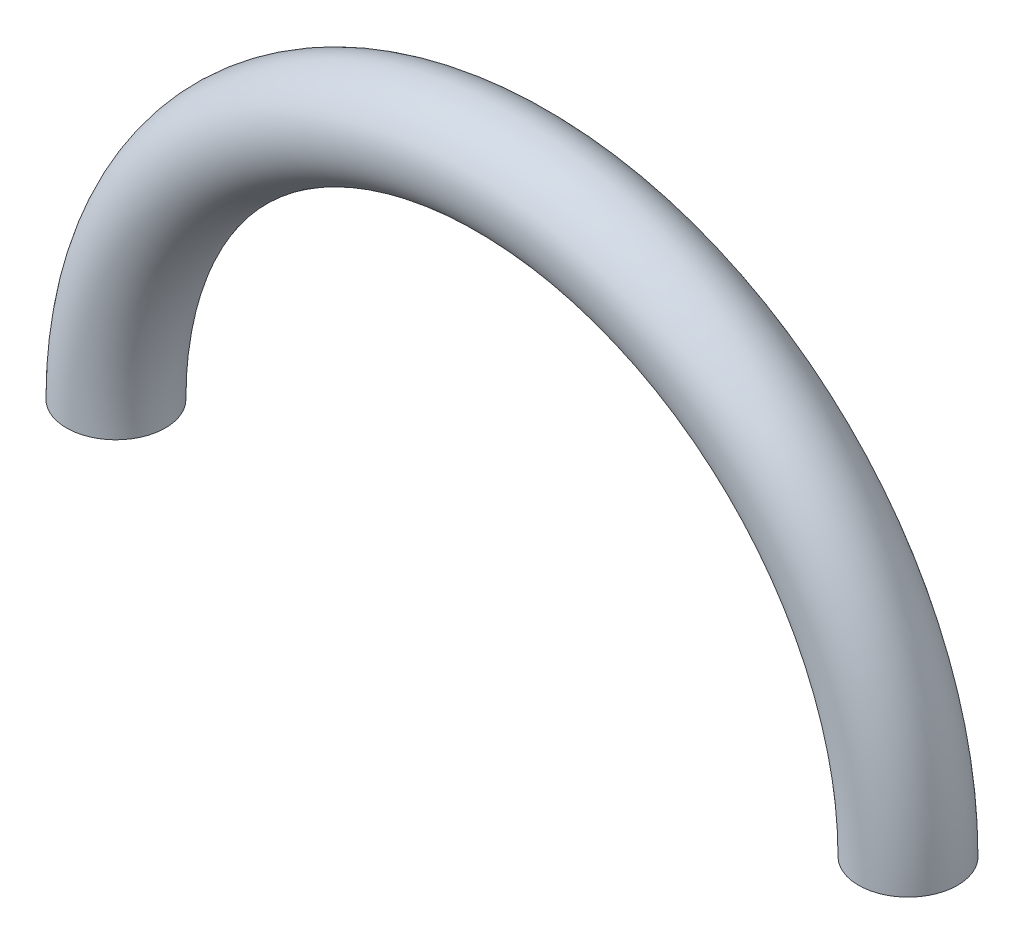
ISO-10303-21;
HEADER;
FILE_DESCRIPTION(('STEP AP214'),'2;1');
FILE_NAME('part.step','',(''),(''),'','','');
FILE_SCHEMA(('AUTOMOTIVE_DESIGN { 1 0 10303 214 1 1 1 1 }'));
ENDSEC;
DATA;
#1=APPLICATION_CONTEXT('core data for automotive mechanical design processes');
#2=APPLICATION_PROTOCOL_DEFINITION('international standard','automotive_design',2000,#1);
#3=PRODUCT_CONTEXT('',#1,'mechanical');
#4=PRODUCT('Part','Part','',(#3));
#5=PRODUCT_RELATED_PRODUCT_CATEGORY('part','',(#4));
#6=PRODUCT_DEFINITION_FORMATION('','',#4);
#7=PRODUCT_DEFINITION_CONTEXT('part definition',#1,'design');
#8=PRODUCT_DEFINITION('design','',#6,#7);
#9=PRODUCT_DEFINITION_SHAPE('','',#8);
#10=(LENGTH_UNIT() NAMED_UNIT(*) SI_UNIT(.MILLI.,.METRE.));
#11=(NAMED_UNIT(*) PLANE_ANGLE_UNIT() SI_UNIT($,.RADIAN.));
#12=(NAMED_UNIT(*) SI_UNIT($,.STERADIAN.) SOLID_ANGLE_UNIT());
#13=UNCERTAINTY_MEASURE_WITH_UNIT(LENGTH_MEASURE(1.E-05),#10,'distance_accuracy_value','');
#14=(GEOMETRIC_REPRESENTATION_CONTEXT(3) GLOBAL_UNCERTAINTY_ASSIGNED_CONTEXT((#13)) GLOBAL_UNIT_ASSIGNED_CONTEXT((#10,
#11,#12)) REPRESENTATION_CONTEXT('',''));
#15=CARTESIAN_POINT('',(0.,0.,0.));
#16=DIRECTION('',(0.,0.,1.));
#17=DIRECTION('',(1.,0.,0.));
#18=AXIS2_PLACEMENT_3D('',#15,#16,#17);
#19=CARTESIAN_POINT('',(0.,0.,0.));
#20=DIRECTION('',(0.,0.,-1.));
#21=DIRECTION('',(-1.,0.,0.));
#22=AXIS2_PLACEMENT_3D('',#19,#20,#21);
#23=TOROIDAL_SURFACE('',#22,127.,12.69);
#24=CARTESIAN_POINT('',(-127.,-8.86836260066156E-13,0.));
#25=DIRECTION('',(0.,1.,0.));
#26=DIRECTION('',(0.,0.,-1.));
#27=AXIS2_PLACEMENT_3D('',#24,#25,#26);
#28=CIRCLE('',#27,12.69);
#29=CARTESIAN_POINT('',(-139.69,-9.75450056445995E-13,0.));
#30=VERTEX_POINT('',#29);
#31=EDGE_CURVE('E11',#30,#30,#28,.T.);
#32=CARTESIAN_POINT('',(127.,0.,0.));
#33=DIRECTION('',(0.,-1.,0.));
#34=DIRECTION('',(0.,0.,-1.));
#35=AXIS2_PLACEMENT_3D('',#32,#33,#34);
#36=CIRCLE('',#35,12.69);
#37=CARTESIAN_POINT('',(139.69,0.,0.));
#38=VERTEX_POINT('',#37);
#39=EDGE_CURVE('E62',#38,#38,#36,.T.);
#40=CARTESIAN_POINT('',(0.,0.,0.));
#41=DIRECTION('',(0.,0.,-1.));
#42=DIRECTION('',(-1.,0.,0.));
#43=AXIS2_PLACEMENT_3D('',#40,#41,#42);
#44=CIRCLE('',#43,139.69);
#45=EDGE_CURVE('',#30,#38,#44,.T.);
#46=ORIENTED_EDGE('',*,*,#31,.T.);
#47=ORIENTED_EDGE('',*,*,#39,.F.);
#48=ORIENTED_EDGE('',*,*,#45,.T.);
#49=ORIENTED_EDGE('',*,*,#45,.F.);
#50=EDGE_LOOP('',(#46,#48,#47,#49));
#51=FACE_BOUND('',#50,.T.);
#52=ADVANCED_FACE('F55',(#51),#23,.T.);
#53=CARTESIAN_POINT('',(-127.,-8.86836260066156E-13,0.));
#54=DIRECTION('',(0.,1.,0.));
#55=DIRECTION('',(0.,0.,-1.));
#56=AXIS2_PLACEMENT_3D('',#53,#54,#55);
#57=PLANE('',#56);
#58=ORIENTED_EDGE('',*,*,#31,.F.);
#59=EDGE_LOOP('',(#58));
#60=FACE_BOUND('',#59,.T.);
#61=ADVANCED_FACE('F72',(#60),#57,.F.);
#62=CARTESIAN_POINT('',(127.,0.,0.));
#63=DIRECTION('',(0.,-1.,0.));
#64=DIRECTION('',(0.,0.,-1.));
#65=AXIS2_PLACEMENT_3D('',#62,#63,#64);
#66=PLANE('',#65);
#67=ORIENTED_EDGE('',*,*,#39,.T.);
#68=EDGE_LOOP('',(#67));
#69=FACE_BOUND('',#68,.T.);
#70=ADVANCED_FACE('F69',(#69),#66,.T.);
#71=CLOSED_SHELL('',(#52,#61,#70));
#72=MANIFOLD_SOLID_BREP('B2',#71);
#73=CARTESIAN_POINT('',(0.,0.,0.));
#74=DIRECTION('',(0.,0.,-1.));
#75=DIRECTION('',(-1.,0.,0.));
#76=AXIS2_PLACEMENT_3D('',#73,#74,#75);
#77=TOROIDAL_SURFACE('',#76,127.,12.7);
#78=CARTESIAN_POINT('',(-127.,-8.86836260066156E-13,0.));
#79=DIRECTION('',(0.,-1.,0.));
#80=DIRECTION('',(0.,0.,1.));
#81=AXIS2_PLACEMENT_3D('',#78,#79,#80);
#82=CIRCLE('',#81,12.7);
#83=CARTESIAN_POINT('',(-139.7,-9.75519886072771E-13,0.));
#84=VERTEX_POINT('',#83);
#85=EDGE_CURVE('E105',#84,#84,#82,.T.);
#86=CARTESIAN_POINT('',(127.,0.,0.));
#87=DIRECTION('',(0.,1.,0.));
#88=DIRECTION('',(0.,0.,1.));
#89=AXIS2_PLACEMENT_3D('',#86,#87,#88);
#90=CIRCLE('',#89,12.7);
#91=CARTESIAN_POINT('',(139.7,0.,0.));
#92=VERTEX_POINT('',#91);
#93=EDGE_CURVE('E113',#92,#92,#90,.T.);
#94=CARTESIAN_POINT('',(0.,0.,0.));
#95=DIRECTION('',(0.,0.,-1.));
#96=DIRECTION('',(-1.,0.,0.));
#97=AXIS2_PLACEMENT_3D('',#94,#95,#96);
#98=CIRCLE('',#97,139.7);
#99=EDGE_CURVE('',#84,#92,#98,.T.);
#100=ORIENTED_EDGE('',*,*,#85,.T.);
#101=ORIENTED_EDGE('',*,*,#93,.F.);
#102=ORIENTED_EDGE('',*,*,#99,.T.);
#103=ORIENTED_EDGE('',*,*,#99,.F.);
#104=EDGE_LOOP('',(#100,#102,#101,#103));
#105=FACE_BOUND('',#104,.T.);
#106=ADVANCED_FACE('F98',(#105),#77,.F.);
#107=CARTESIAN_POINT('',(0.,0.,0.));
#108=DIRECTION('',(0.,0.,-1.));
#109=DIRECTION('',(-1.,0.,0.));
#110=AXIS2_PLACEMENT_3D('',#107,#108,#109);
#111=TOROIDAL_SURFACE('',#110,127.,15.875);
#112=CARTESIAN_POINT('',(-127.,-8.86836260066156E-13,0.));
#113=DIRECTION('',(0.,-1.,0.));
#114=DIRECTION('',(0.,0.,1.));
#115=AXIS2_PLACEMENT_3D('',#112,#113,#114);
#116=CIRCLE('',#115,15.875);
#117=CARTESIAN_POINT('',(-142.875,-9.97690792574425E-13,0.));
#118=VERTEX_POINT('',#117);
#119=EDGE_CURVE('E54',#118,#118,#116,.T.);
#120=CARTESIAN_POINT('',(127.,0.,0.));
#121=DIRECTION('',(0.,1.,0.));
#122=DIRECTION('',(0.,0.,1.));
#123=AXIS2_PLACEMENT_3D('',#120,#121,#122);
#124=CIRCLE('',#123,15.875);
#125=CARTESIAN_POINT('',(142.875,0.,0.));
#126=VERTEX_POINT('',#125);
#127=EDGE_CURVE('E109',#126,#126,#124,.T.);
#128=CARTESIAN_POINT('',(0.,0.,0.));
#129=DIRECTION('',(0.,0.,-1.));
#130=DIRECTION('',(-1.,0.,0.));
#131=AXIS2_PLACEMENT_3D('',#128,#129,#130);
#132=CIRCLE('',#131,142.875);
#133=EDGE_CURVE('',#118,#126,#132,.T.);
#134=ORIENTED_EDGE('',*,*,#119,.F.);
#135=ORIENTED_EDGE('',*,*,#127,.T.);
#136=ORIENTED_EDGE('',*,*,#133,.T.);
#137=ORIENTED_EDGE('',*,*,#133,.F.);
#138=EDGE_LOOP('',(#134,#136,#135,#137));
#139=FACE_BOUND('',#138,.T.);
#140=ADVANCED_FACE('F100',(#139),#111,.T.);
#141=CARTESIAN_POINT('',(-127.,-8.86836260066156E-13,0.));
#142=DIRECTION('',(0.,-1.,0.));
#143=DIRECTION('',(0.,0.,1.));
#144=AXIS2_PLACEMENT_3D('',#141,#142,#143);
#145=PLANE('',#144);
#146=ORIENTED_EDGE('',*,*,#85,.F.);
#147=EDGE_LOOP('',(#146));
#148=FACE_BOUND('',#147,.T.);
#149=ORIENTED_EDGE('',*,*,#119,.T.);
#150=EDGE_LOOP('',(#149));
#151=FACE_BOUND('',#150,.T.);
#152=ADVANCED_FACE('F127',(#148,#151),#145,.T.);
#153=CARTESIAN_POINT('',(127.,0.,0.));
#154=DIRECTION('',(0.,1.,0.));
#155=DIRECTION('',(0.,0.,1.));
#156=AXIS2_PLACEMENT_3D('',#153,#154,#155);
#157=PLANE('',#156);
#158=ORIENTED_EDGE('',*,*,#93,.T.);
#159=EDGE_LOOP('',(#158));
#160=FACE_BOUND('',#159,.T.);
#161=ORIENTED_EDGE('',*,*,#127,.F.);
#162=EDGE_LOOP('',(#161));
#163=FACE_BOUND('',#162,.T.);
#164=ADVANCED_FACE('F119',(#160,#163),#157,.F.);
#165=CLOSED_SHELL('',(#106,#140,#152,#164));
#166=MANIFOLD_SOLID_BREP('B6',#165);
#167=ADVANCED_BREP_SHAPE_REPRESENTATION('',(#18,#72,#166),#14);
#168=SHAPE_DEFINITION_REPRESENTATION(#9,#167);
ENDSEC;
END-ISO-10303-21;
